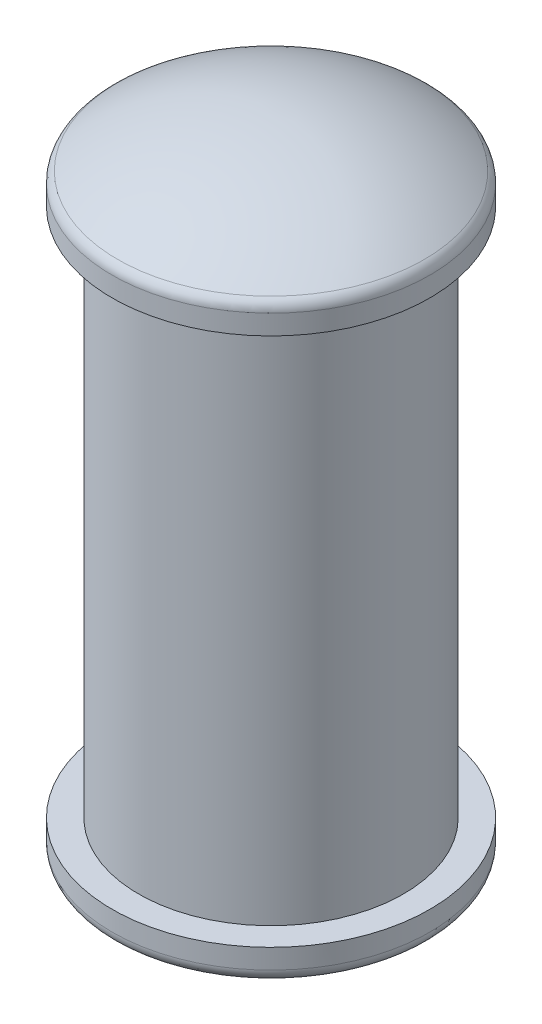
ISO-10303-21;
HEADER;
FILE_DESCRIPTION(('STEP AP214'),'2;1');
FILE_NAME('part.step','',(''),(''),'','','');
FILE_SCHEMA(('AUTOMOTIVE_DESIGN { 1 0 10303 214 1 1 1 1 }'));
ENDSEC;
DATA;
#1=APPLICATION_CONTEXT('core data for automotive mechanical design processes');
#2=APPLICATION_PROTOCOL_DEFINITION('international standard','automotive_design',2000,#1);
#3=PRODUCT_CONTEXT('',#1,'mechanical');
#4=PRODUCT('Part','Part','',(#3));
#5=PRODUCT_RELATED_PRODUCT_CATEGORY('part','',(#4));
#6=PRODUCT_DEFINITION_FORMATION('','',#4);
#7=PRODUCT_DEFINITION_CONTEXT('part definition',#1,'design');
#8=PRODUCT_DEFINITION('design','',#6,#7);
#9=PRODUCT_DEFINITION_SHAPE('','',#8);
#10=(LENGTH_UNIT() NAMED_UNIT(*) SI_UNIT(.MILLI.,.METRE.));
#11=(NAMED_UNIT(*) PLANE_ANGLE_UNIT() SI_UNIT($,.RADIAN.));
#12=(NAMED_UNIT(*) SI_UNIT($,.STERADIAN.) SOLID_ANGLE_UNIT());
#13=UNCERTAINTY_MEASURE_WITH_UNIT(LENGTH_MEASURE(1.E-05),#10,'distance_accuracy_value','');
#14=(GEOMETRIC_REPRESENTATION_CONTEXT(3) GLOBAL_UNCERTAINTY_ASSIGNED_CONTEXT((#13)) GLOBAL_UNIT_ASSIGNED_CONTEXT((#10,
#11,#12)) REPRESENTATION_CONTEXT('',''));
#15=CARTESIAN_POINT('',(0.,0.,0.));
#16=DIRECTION('',(0.,0.,1.));
#17=DIRECTION('',(1.,0.,0.));
#18=AXIS2_PLACEMENT_3D('',#15,#16,#17);
#19=CARTESIAN_POINT('',(0.,1.5,0.));
#20=DIRECTION('',(0.,0.,1.));
#21=DIRECTION('',(1.,0.,0.));
#22=AXIS2_PLACEMENT_3D('',#19,#20,#21);
#23=SPHERICAL_SURFACE('',#22,5.);
#24=CARTESIAN_POINT('',(0.,1.5,0.));
#25=DIRECTION('',(0.,-1.,0.));
#26=DIRECTION('',(0.,0.,-1.));
#27=AXIS2_PLACEMENT_3D('',#24,#25,#26);
#28=SPHERICAL_SURFACE('',#27,5.);
#29=CARTESIAN_POINT('',(0.,5.57682457495518,0.));
#30=DIRECTION('',(0.,-1.,0.));
#31=DIRECTION('',(0.,0.,-1.));
#32=AXIS2_PLACEMENT_3D('',#29,#30,#31);
#33=CIRCLE('',#32,2.89473684210526);
#34=CARTESIAN_POINT('',(0.,5.57682457495518,-2.89473684210526));
#35=VERTEX_POINT('',#34);
#36=EDGE_CURVE('E10',#35,#35,#33,.F.);
#37=ORIENTED_EDGE('',*,*,#36,.T.);
#38=EDGE_LOOP('',(#37));
#39=FACE_BOUND('',#38,.T.);
#40=ADVANCED_FACE('F34',(#39),#28,.T.);
#41=CARTESIAN_POINT('',(0.,0.,0.));
#42=DIRECTION('',(0.,-1.,0.));
#43=DIRECTION('',(0.,0.,-1.));
#44=AXIS2_PLACEMENT_3D('',#41,#42,#43);
#45=CYLINDRICAL_SURFACE('',#44,3.);
#46=CARTESIAN_POINT('',(0.,5.37298334620742,0.));
#47=DIRECTION('',(0.,-1.,0.));
#48=DIRECTION('',(0.,0.,-1.));
#49=AXIS2_PLACEMENT_3D('',#46,#47,#48);
#50=CIRCLE('',#49,3.);
#51=CARTESIAN_POINT('',(0.,5.37298334620742,-3.));
#52=VERTEX_POINT('',#51);
#53=EDGE_CURVE('E42',#52,#52,#50,.T.);
#54=ORIENTED_EDGE('',*,*,#53,.T.);
#55=EDGE_LOOP('',(#54));
#56=FACE_BOUND('',#55,.T.);
#57=CARTESIAN_POINT('',(0.,5.,0.));
#58=DIRECTION('',(0.,-1.,0.));
#59=DIRECTION('',(0.,0.,-1.));
#60=AXIS2_PLACEMENT_3D('',#57,#58,#59);
#61=CIRCLE('',#60,3.);
#62=CARTESIAN_POINT('',(0.,5.,-3.));
#63=VERTEX_POINT('',#62);
#64=EDGE_CURVE('E60',#63,#63,#61,.T.);
#65=ORIENTED_EDGE('',*,*,#64,.F.);
#66=EDGE_LOOP('',(#65));
#67=FACE_BOUND('',#66,.T.);
#68=ADVANCED_FACE('F94',(#56,#67),#45,.T.);
#69=CARTESIAN_POINT('',(-3.,5.,0.));
#70=DIRECTION('',(0.,1.,0.));
#71=DIRECTION('',(0.,0.,1.));
#72=AXIS2_PLACEMENT_3D('',#69,#70,#71);
#73=PLANE('',#72);
#74=CARTESIAN_POINT('',(0.,5.,0.));
#75=DIRECTION('',(0.,-1.,0.));
#76=DIRECTION('',(0.,0.,-1.));
#77=AXIS2_PLACEMENT_3D('',#74,#75,#76);
#78=CIRCLE('',#77,2.5);
#79=CARTESIAN_POINT('',(0.,5.,-2.5));
#80=VERTEX_POINT('',#79);
#81=EDGE_CURVE('E64',#80,#80,#78,.T.);
#82=ORIENTED_EDGE('',*,*,#81,.F.);
#83=EDGE_LOOP('',(#82));
#84=FACE_BOUND('',#83,.T.);
#85=ORIENTED_EDGE('',*,*,#64,.T.);
#86=EDGE_LOOP('',(#85));
#87=FACE_BOUND('',#86,.T.);
#88=ADVANCED_FACE('F84',(#84,#87),#73,.F.);
#89=CARTESIAN_POINT('',(0.,0.,0.));
#90=DIRECTION('',(0.,-1.,0.));
#91=DIRECTION('',(0.,0.,-1.));
#92=AXIS2_PLACEMENT_3D('',#89,#90,#91);
#93=CYLINDRICAL_SURFACE('',#92,2.5);
#94=ORIENTED_EDGE('',*,*,#81,.T.);
#95=EDGE_LOOP('',(#94));
#96=FACE_BOUND('',#95,.T.);
#97=CARTESIAN_POINT('',(0.,-5.,0.));
#98=DIRECTION('',(0.,-1.,0.));
#99=DIRECTION('',(0.,0.,-1.));
#100=AXIS2_PLACEMENT_3D('',#97,#98,#99);
#101=CIRCLE('',#100,2.5);
#102=CARTESIAN_POINT('',(0.,-5.,-2.5));
#103=VERTEX_POINT('',#102);
#104=EDGE_CURVE('E72',#103,#103,#101,.T.);
#105=ORIENTED_EDGE('',*,*,#104,.F.);
#106=EDGE_LOOP('',(#105));
#107=FACE_BOUND('',#106,.T.);
#108=ADVANCED_FACE('F81',(#96,#107),#93,.T.);
#109=CARTESIAN_POINT('',(0.,-1.5,0.));
#110=DIRECTION('',(0.,0.,1.));
#111=DIRECTION('',(1.,0.,0.));
#112=AXIS2_PLACEMENT_3D('',#109,#110,#111);
#113=SPHERICAL_SURFACE('',#112,5.);
#114=CARTESIAN_POINT('',(0.,-1.5,0.));
#115=DIRECTION('',(0.,1.,0.));
#116=DIRECTION('',(0.,0.,1.));
#117=AXIS2_PLACEMENT_3D('',#114,#115,#116);
#118=SPHERICAL_SURFACE('',#117,5.);
#119=CARTESIAN_POINT('',(0.,-5.57682457495518,0.));
#120=DIRECTION('',(0.,1.,0.));
#121=DIRECTION('',(0.,0.,1.));
#122=AXIS2_PLACEMENT_3D('',#119,#120,#121);
#123=CIRCLE('',#122,2.89473684210526);
#124=CARTESIAN_POINT('',(0.,-5.57682457495518,2.89473684210526));
#125=VERTEX_POINT('',#124);
#126=EDGE_CURVE('E54',#125,#125,#123,.F.);
#127=ORIENTED_EDGE('',*,*,#126,.T.);
#128=EDGE_LOOP('',(#127));
#129=FACE_BOUND('',#128,.T.);
#130=ADVANCED_FACE('F83',(#129),#118,.T.);
#131=CARTESIAN_POINT('',(0.,0.,0.));
#132=DIRECTION('',(0.,1.,0.));
#133=DIRECTION('',(0.,0.,-1.));
#134=AXIS2_PLACEMENT_3D('',#131,#132,#133);
#135=CYLINDRICAL_SURFACE('',#134,3.);
#136=CARTESIAN_POINT('',(0.,-5.37298334620742,0.));
#137=DIRECTION('',(0.,1.,0.));
#138=DIRECTION('',(0.,0.,1.));
#139=AXIS2_PLACEMENT_3D('',#136,#137,#138);
#140=CIRCLE('',#139,3.);
#141=CARTESIAN_POINT('',(0.,-5.37298334620742,3.));
#142=VERTEX_POINT('',#141);
#143=EDGE_CURVE('E48',#142,#142,#140,.T.);
#144=ORIENTED_EDGE('',*,*,#143,.T.);
#145=EDGE_LOOP('',(#144));
#146=FACE_BOUND('',#145,.T.);
#147=CARTESIAN_POINT('',(0.,-5.,0.));
#148=DIRECTION('',(0.,-1.,0.));
#149=DIRECTION('',(0.,0.,-1.));
#150=AXIS2_PLACEMENT_3D('',#147,#148,#149);
#151=CIRCLE('',#150,3.);
#152=CARTESIAN_POINT('',(0.,-5.,-3.));
#153=VERTEX_POINT('',#152);
#154=EDGE_CURVE('E68',#153,#153,#151,.T.);
#155=ORIENTED_EDGE('',*,*,#154,.T.);
#156=EDGE_LOOP('',(#155));
#157=FACE_BOUND('',#156,.T.);
#158=ADVANCED_FACE('F91',(#146,#157),#135,.T.);
#159=CARTESIAN_POINT('',(-3.,-5.,0.));
#160=DIRECTION('',(0.,-1.,0.));
#161=DIRECTION('',(0.,0.,1.));
#162=AXIS2_PLACEMENT_3D('',#159,#160,#161);
#163=PLANE('',#162);
#164=ORIENTED_EDGE('',*,*,#104,.T.);
#165=EDGE_LOOP('',(#164));
#166=FACE_BOUND('',#165,.T.);
#167=ORIENTED_EDGE('',*,*,#154,.F.);
#168=EDGE_LOOP('',(#167));
#169=FACE_BOUND('',#168,.T.);
#170=ADVANCED_FACE('F78',(#166,#169),#163,.F.);
#171=CARTESIAN_POINT('',(0.,-5.37298334620742,0.));
#172=DIRECTION('',(0.,1.,0.));
#173=DIRECTION('',(0.,0.,1.));
#174=AXIS2_PLACEMENT_3D('',#171,#172,#173);
#175=TOROIDAL_SURFACE('',#174,2.75,0.25);
#176=ORIENTED_EDGE('',*,*,#143,.F.);
#177=EDGE_LOOP('',(#176));
#178=FACE_BOUND('',#177,.T.);
#179=ORIENTED_EDGE('',*,*,#126,.F.);
#180=EDGE_LOOP('',(#179));
#181=FACE_BOUND('',#180,.T.);
#182=ADVANCED_FACE('F104',(#178,#181),#175,.T.);
#183=CARTESIAN_POINT('',(0.,5.37298334620742,0.));
#184=DIRECTION('',(0.,-1.,0.));
#185=DIRECTION('',(0.,0.,-1.));
#186=AXIS2_PLACEMENT_3D('',#183,#184,#185);
#187=TOROIDAL_SURFACE('',#186,2.75,0.25);
#188=ORIENTED_EDGE('',*,*,#36,.F.);
#189=EDGE_LOOP('',(#188));
#190=FACE_BOUND('',#189,.T.);
#191=ORIENTED_EDGE('',*,*,#53,.F.);
#192=EDGE_LOOP('',(#191));
#193=FACE_BOUND('',#192,.T.);
#194=ADVANCED_FACE('F36',(#190,#193),#187,.T.);
#195=CLOSED_SHELL('',(#40,#68,#88,#108,#130,#158,#170,#182,#194));
#196=MANIFOLD_SOLID_BREP('B2',#195);
#197=ADVANCED_BREP_SHAPE_REPRESENTATION('',(#18,#196),#14);
#198=SHAPE_DEFINITION_REPRESENTATION(#9,#197);
ENDSEC;
END-ISO-10303-21;
